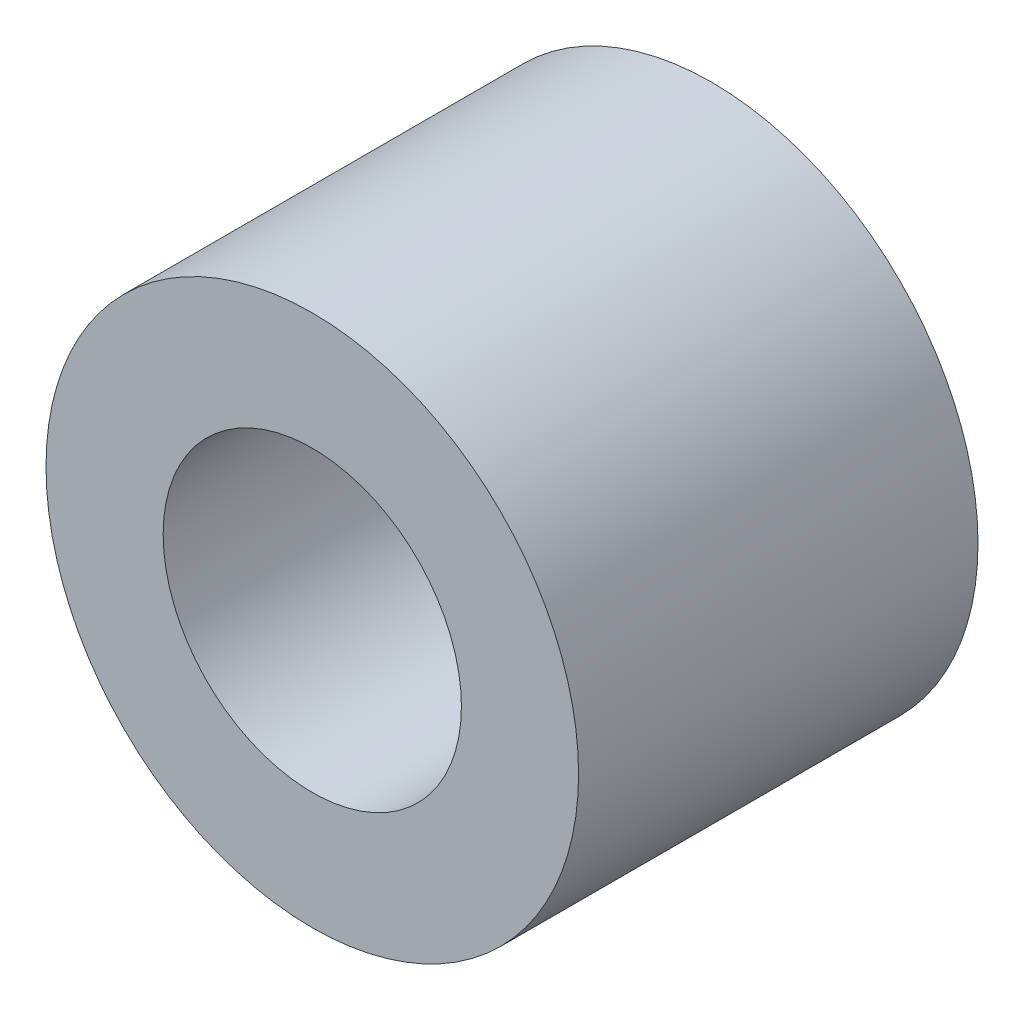
ISO-10303-21;
HEADER;
FILE_DESCRIPTION(('STEP AP214'),'2;1');
FILE_NAME('part.step','',(''),(''),'','','');
FILE_SCHEMA(('AUTOMOTIVE_DESIGN { 1 0 10303 214 1 1 1 1 }'));
ENDSEC;
DATA;
#1=APPLICATION_CONTEXT('core data for automotive mechanical design processes');
#2=APPLICATION_PROTOCOL_DEFINITION('international standard','automotive_design',2000,#1);
#3=PRODUCT_CONTEXT('',#1,'mechanical');
#4=PRODUCT('Part','Part','',(#3));
#5=PRODUCT_RELATED_PRODUCT_CATEGORY('part','',(#4));
#6=PRODUCT_DEFINITION_FORMATION('','',#4);
#7=PRODUCT_DEFINITION_CONTEXT('part definition',#1,'design');
#8=PRODUCT_DEFINITION('design','',#6,#7);
#9=PRODUCT_DEFINITION_SHAPE('','',#8);
#10=(LENGTH_UNIT() NAMED_UNIT(*) SI_UNIT(.MILLI.,.METRE.));
#11=(NAMED_UNIT(*) PLANE_ANGLE_UNIT() SI_UNIT($,.RADIAN.));
#12=(NAMED_UNIT(*) SI_UNIT($,.STERADIAN.) SOLID_ANGLE_UNIT());
#13=UNCERTAINTY_MEASURE_WITH_UNIT(LENGTH_MEASURE(1.E-05),#10,'distance_accuracy_value','');
#14=(GEOMETRIC_REPRESENTATION_CONTEXT(3) GLOBAL_UNCERTAINTY_ASSIGNED_CONTEXT((#13)) GLOBAL_UNIT_ASSIGNED_CONTEXT((#10,
#11,#12)) REPRESENTATION_CONTEXT('',''));
#15=CARTESIAN_POINT('',(0.,0.,0.));
#16=DIRECTION('',(0.,0.,1.));
#17=DIRECTION('',(1.,0.,0.));
#18=AXIS2_PLACEMENT_3D('',#15,#16,#17);
#19=CARTESIAN_POINT('',(0.,0.,2.38125));
#20=DIRECTION('',(0.,0.,1.));
#21=DIRECTION('',(1.,0.,0.));
#22=AXIS2_PLACEMENT_3D('',#19,#20,#21);
#23=PLANE('',#22);
#24=CARTESIAN_POINT('',(0.,0.,2.38125));
#25=DIRECTION('',(0.,0.,1.));
#26=DIRECTION('',(1.,0.,0.));
#27=AXIS2_PLACEMENT_3D('',#24,#25,#26);
#28=CIRCLE('',#27,3.175);
#29=CARTESIAN_POINT('',(-3.175,0.,2.38125));
#30=VERTEX_POINT('',#29);
#31=EDGE_CURVE('E10',#30,#30,#28,.T.);
#32=ORIENTED_EDGE('',*,*,#31,.T.);
#33=EDGE_LOOP('',(#32));
#34=FACE_BOUND('',#33,.T.);
#35=CARTESIAN_POINT('',(0.,0.,2.38125));
#36=DIRECTION('',(0.,0.,1.));
#37=DIRECTION('',(1.,0.,0.));
#38=AXIS2_PLACEMENT_3D('',#35,#36,#37);
#39=CIRCLE('',#38,1.778);
#40=CARTESIAN_POINT('',(-1.778,0.,2.38125));
#41=VERTEX_POINT('',#40);
#42=EDGE_CURVE('E41',#41,#41,#39,.T.);
#43=ORIENTED_EDGE('',*,*,#42,.F.);
#44=EDGE_LOOP('',(#43));
#45=FACE_BOUND('',#44,.T.);
#46=ADVANCED_FACE('F30',(#34,#45),#23,.T.);
#47=CARTESIAN_POINT('',(0.,0.,-2.38125));
#48=DIRECTION('',(0.,0.,1.));
#49=DIRECTION('',(1.,0.,0.));
#50=AXIS2_PLACEMENT_3D('',#47,#48,#49);
#51=PLANE('',#50);
#52=CARTESIAN_POINT('',(0.,0.,-2.38125));
#53=DIRECTION('',(0.,0.,1.));
#54=DIRECTION('',(1.,0.,0.));
#55=AXIS2_PLACEMENT_3D('',#52,#53,#54);
#56=CIRCLE('',#55,3.175);
#57=CARTESIAN_POINT('',(-3.175,0.,-2.38125));
#58=VERTEX_POINT('',#57);
#59=EDGE_CURVE('E34',#58,#58,#56,.T.);
#60=ORIENTED_EDGE('',*,*,#59,.F.);
#61=EDGE_LOOP('',(#60));
#62=FACE_BOUND('',#61,.T.);
#63=CARTESIAN_POINT('',(0.,0.,-2.38125));
#64=DIRECTION('',(0.,0.,1.));
#65=DIRECTION('',(1.,0.,0.));
#66=AXIS2_PLACEMENT_3D('',#63,#64,#65);
#67=CIRCLE('',#66,1.778);
#68=CARTESIAN_POINT('',(-1.778,0.,-2.38125));
#69=VERTEX_POINT('',#68);
#70=EDGE_CURVE('E43',#69,#69,#67,.T.);
#71=ORIENTED_EDGE('',*,*,#70,.T.);
#72=EDGE_LOOP('',(#71));
#73=FACE_BOUND('',#72,.T.);
#74=ADVANCED_FACE('F53',(#62,#73),#51,.F.);
#75=CARTESIAN_POINT('',(0.,0.,2.38125));
#76=DIRECTION('',(0.,0.,-1.));
#77=DIRECTION('',(-1.,0.,0.));
#78=AXIS2_PLACEMENT_3D('',#75,#76,#77);
#79=CYLINDRICAL_SURFACE('',#78,3.175);
#80=CARTESIAN_POINT('',(-3.175,0.,2.38125));
#81=CARTESIAN_POINT('',(-3.175,0.,2.331640625));
#82=CARTESIAN_POINT('',(-3.175,0.,2.28203125));
#83=CARTESIAN_POINT('',(-3.175,0.,2.1828125));
#84=CARTESIAN_POINT('',(-3.175,0.,2.133203125));
#85=CARTESIAN_POINT('',(-3.175,0.,2.033984375));
#86=CARTESIAN_POINT('',(-3.175,0.,1.984375));
#87=CARTESIAN_POINT('',(-3.175,0.,1.88515625));
#88=CARTESIAN_POINT('',(-3.175,0.,1.835546875));
#89=CARTESIAN_POINT('',(-3.175,0.,1.736328125));
#90=CARTESIAN_POINT('',(-3.175,0.,1.68671875));
#91=CARTESIAN_POINT('',(-3.175,0.,1.5875));
#92=CARTESIAN_POINT('',(-3.175,0.,1.537890625));
#93=CARTESIAN_POINT('',(-3.175,0.,1.438671875));
#94=CARTESIAN_POINT('',(-3.175,0.,1.3890625));
#95=CARTESIAN_POINT('',(-3.175,0.,1.28984375));
#96=CARTESIAN_POINT('',(-3.175,0.,1.240234375));
#97=CARTESIAN_POINT('',(-3.175,0.,1.141015625));
#98=CARTESIAN_POINT('',(-3.175,0.,1.09140625));
#99=CARTESIAN_POINT('',(-3.175,0.,0.9921875));
#100=CARTESIAN_POINT('',(-3.175,0.,0.942578125));
#101=CARTESIAN_POINT('',(-3.175,0.,0.843359375));
#102=CARTESIAN_POINT('',(-3.175,0.,0.79375));
#103=CARTESIAN_POINT('',(-3.175,0.,0.69453125));
#104=CARTESIAN_POINT('',(-3.175,0.,0.644921875));
#105=CARTESIAN_POINT('',(-3.175,0.,0.545703125));
#106=CARTESIAN_POINT('',(-3.175,0.,0.49609375));
#107=CARTESIAN_POINT('',(-3.175,0.,0.396875));
#108=CARTESIAN_POINT('',(-3.175,0.,0.347265625));
#109=CARTESIAN_POINT('',(-3.175,0.,0.248046875));
#110=CARTESIAN_POINT('',(-3.175,0.,0.1984375));
#111=CARTESIAN_POINT('',(-3.175,0.,0.0992187499999996));
#112=CARTESIAN_POINT('',(-3.175,0.,0.0496093749999996));
#113=CARTESIAN_POINT('',(-3.175,0.,-0.0496093750000005));
#114=CARTESIAN_POINT('',(-3.175,0.,-0.0992187500000005));
#115=CARTESIAN_POINT('',(-3.175,0.,-0.198437500000001));
#116=CARTESIAN_POINT('',(-3.175,0.,-0.248046875000001));
#117=CARTESIAN_POINT('',(-3.175,0.,-0.347265625000001));
#118=CARTESIAN_POINT('',(-3.175,0.,-0.396875000000001));
#119=CARTESIAN_POINT('',(-3.175,0.,-0.496093750000001));
#120=CARTESIAN_POINT('',(-3.175,0.,-0.545703125000001));
#121=CARTESIAN_POINT('',(-3.175,0.,-0.644921875000001));
#122=CARTESIAN_POINT('',(-3.175,0.,-0.694531250000001));
#123=CARTESIAN_POINT('',(-3.175,0.,-0.793750000000001));
#124=CARTESIAN_POINT('',(-3.175,0.,-0.843359375));
#125=CARTESIAN_POINT('',(-3.175,0.,-0.942578125000001));
#126=CARTESIAN_POINT('',(-3.175,0.,-0.992187500000001));
#127=CARTESIAN_POINT('',(-3.175,0.,-1.09140625));
#128=CARTESIAN_POINT('',(-3.175,0.,-1.141015625));
#129=CARTESIAN_POINT('',(-3.175,0.,-1.240234375));
#130=CARTESIAN_POINT('',(-3.175,0.,-1.28984375));
#131=CARTESIAN_POINT('',(-3.175,0.,-1.3890625));
#132=CARTESIAN_POINT('',(-3.175,0.,-1.438671875));
#133=CARTESIAN_POINT('',(-3.175,0.,-1.537890625));
#134=CARTESIAN_POINT('',(-3.175,0.,-1.5875));
#135=CARTESIAN_POINT('',(-3.175,0.,-1.68671875));
#136=CARTESIAN_POINT('',(-3.175,0.,-1.736328125));
#137=CARTESIAN_POINT('',(-3.175,0.,-1.835546875));
#138=CARTESIAN_POINT('',(-3.175,0.,-1.88515625));
#139=CARTESIAN_POINT('',(-3.175,0.,-1.984375));
#140=CARTESIAN_POINT('',(-3.175,0.,-2.033984375));
#141=CARTESIAN_POINT('',(-3.175,0.,-2.133203125));
#142=CARTESIAN_POINT('',(-3.175,0.,-2.1828125));
#143=CARTESIAN_POINT('',(-3.175,0.,-2.28203125));
#144=CARTESIAN_POINT('',(-3.175,0.,-2.331640625));
#145=CARTESIAN_POINT('',(-3.175,0.,-2.38125));
#146=B_SPLINE_CURVE_WITH_KNOTS('',3,(#80,#81,#82,#83,#84,#85,#86,#87,#88,#89,#90,#91,#92,#93,
#94,#95,#96,#97,#98,#99,#100,#101,#102,#103,#104,#105,#106,#107,#108,#109,#110,#111,#112,#113,
#114,#115,#116,#117,#118,#119,#120,#121,#122,#123,#124,#125,#126,#127,#128,#129,#130,#131,#132,
#133,#134,#135,#136,#137,#138,#139,#140,#141,#142,#143,#144,#145),.UNSPECIFIED.,.F.,.F.,(4,2,2,
2,2,2,2,2,2,2,2,2,2,2,2,2,2,2,2,2,2,2,2,2,2,2,2,2,2,2,2,2,4),(0.,0.148828125,0.29765625,
0.446484375,0.5953125,0.744140625,0.89296875,1.041796875,1.190625,1.339453125,1.48828125,
1.637109375,1.7859375,1.934765625,2.08359375,2.232421875,2.38125,2.530078125,2.67890625,
2.827734375,2.9765625,3.125390625,3.27421875,3.423046875,3.571875,3.720703125,3.86953125,
4.018359375,4.1671875,4.316015625,4.46484375,4.613671875,4.7625),.UNSPECIFIED.);
#147=EDGE_CURVE('BSEAM32',#30,#58,#146,.T.);
#148=ORIENTED_EDGE('',*,*,#31,.F.);
#149=ORIENTED_EDGE('',*,*,#59,.T.);
#150=ORIENTED_EDGE('',*,*,#147,.T.);
#151=ORIENTED_EDGE('',*,*,#147,.F.);
#152=EDGE_LOOP('',(#148,#150,#149,#151));
#153=FACE_BOUND('',#152,.T.);
#154=ADVANCED_FACE('F32',(#153),#79,.T.);
#155=CARTESIAN_POINT('',(0.,0.,2.38125));
#156=DIRECTION('',(0.,0.,-1.));
#157=DIRECTION('',(-1.,0.,0.));
#158=AXIS2_PLACEMENT_3D('',#155,#156,#157);
#159=CYLINDRICAL_SURFACE('',#158,1.778);
#160=CARTESIAN_POINT('',(-1.778,0.,2.38125));
#161=CARTESIAN_POINT('',(-1.778,0.,2.331640625));
#162=CARTESIAN_POINT('',(-1.778,0.,2.28203125));
#163=CARTESIAN_POINT('',(-1.778,0.,2.1828125));
#164=CARTESIAN_POINT('',(-1.778,0.,2.133203125));
#165=CARTESIAN_POINT('',(-1.778,0.,2.033984375));
#166=CARTESIAN_POINT('',(-1.778,0.,1.984375));
#167=CARTESIAN_POINT('',(-1.778,0.,1.88515625));
#168=CARTESIAN_POINT('',(-1.778,0.,1.835546875));
#169=CARTESIAN_POINT('',(-1.778,0.,1.736328125));
#170=CARTESIAN_POINT('',(-1.778,0.,1.68671875));
#171=CARTESIAN_POINT('',(-1.778,0.,1.5875));
#172=CARTESIAN_POINT('',(-1.778,0.,1.537890625));
#173=CARTESIAN_POINT('',(-1.778,0.,1.438671875));
#174=CARTESIAN_POINT('',(-1.778,0.,1.3890625));
#175=CARTESIAN_POINT('',(-1.778,0.,1.28984375));
#176=CARTESIAN_POINT('',(-1.778,0.,1.240234375));
#177=CARTESIAN_POINT('',(-1.778,0.,1.141015625));
#178=CARTESIAN_POINT('',(-1.778,0.,1.09140625));
#179=CARTESIAN_POINT('',(-1.778,0.,0.9921875));
#180=CARTESIAN_POINT('',(-1.778,0.,0.942578125));
#181=CARTESIAN_POINT('',(-1.778,0.,0.843359375));
#182=CARTESIAN_POINT('',(-1.778,0.,0.79375));
#183=CARTESIAN_POINT('',(-1.778,0.,0.69453125));
#184=CARTESIAN_POINT('',(-1.778,0.,0.644921875));
#185=CARTESIAN_POINT('',(-1.778,0.,0.545703125));
#186=CARTESIAN_POINT('',(-1.778,0.,0.49609375));
#187=CARTESIAN_POINT('',(-1.778,0.,0.396875));
#188=CARTESIAN_POINT('',(-1.778,0.,0.347265625));
#189=CARTESIAN_POINT('',(-1.778,0.,0.248046875));
#190=CARTESIAN_POINT('',(-1.778,0.,0.1984375));
#191=CARTESIAN_POINT('',(-1.778,0.,0.09921875));
#192=CARTESIAN_POINT('',(-1.778,0.,0.049609375));
#193=CARTESIAN_POINT('',(-1.778,0.,-0.049609375));
#194=CARTESIAN_POINT('',(-1.778,0.,-0.09921875));
#195=CARTESIAN_POINT('',(-1.778,0.,-0.1984375));
#196=CARTESIAN_POINT('',(-1.778,0.,-0.248046875));
#197=CARTESIAN_POINT('',(-1.778,0.,-0.347265625));
#198=CARTESIAN_POINT('',(-1.778,0.,-0.396875));
#199=CARTESIAN_POINT('',(-1.778,0.,-0.49609375));
#200=CARTESIAN_POINT('',(-1.778,0.,-0.545703125));
#201=CARTESIAN_POINT('',(-1.778,0.,-0.644921875));
#202=CARTESIAN_POINT('',(-1.778,0.,-0.69453125));
#203=CARTESIAN_POINT('',(-1.778,0.,-0.79375));
#204=CARTESIAN_POINT('',(-1.778,0.,-0.843359375));
#205=CARTESIAN_POINT('',(-1.778,0.,-0.942578125));
#206=CARTESIAN_POINT('',(-1.778,0.,-0.9921875));
#207=CARTESIAN_POINT('',(-1.778,0.,-1.09140625));
#208=CARTESIAN_POINT('',(-1.778,0.,-1.141015625));
#209=CARTESIAN_POINT('',(-1.778,0.,-1.240234375));
#210=CARTESIAN_POINT('',(-1.778,0.,-1.28984375));
#211=CARTESIAN_POINT('',(-1.778,0.,-1.3890625));
#212=CARTESIAN_POINT('',(-1.778,0.,-1.438671875));
#213=CARTESIAN_POINT('',(-1.778,0.,-1.537890625));
#214=CARTESIAN_POINT('',(-1.778,0.,-1.5875));
#215=CARTESIAN_POINT('',(-1.778,0.,-1.68671875));
#216=CARTESIAN_POINT('',(-1.778,0.,-1.736328125));
#217=CARTESIAN_POINT('',(-1.778,0.,-1.835546875));
#218=CARTESIAN_POINT('',(-1.778,0.,-1.88515625));
#219=CARTESIAN_POINT('',(-1.778,0.,-1.984375));
#220=CARTESIAN_POINT('',(-1.778,0.,-2.033984375));
#221=CARTESIAN_POINT('',(-1.778,0.,-2.133203125));
#222=CARTESIAN_POINT('',(-1.778,0.,-2.1828125));
#223=CARTESIAN_POINT('',(-1.778,0.,-2.28203125));
#224=CARTESIAN_POINT('',(-1.778,0.,-2.331640625));
#225=CARTESIAN_POINT('',(-1.778,0.,-2.38125));
#226=B_SPLINE_CURVE_WITH_KNOTS('',3,(#160,#161,#162,#163,#164,#165,#166,#167,#168,#169,#170,
#171,#172,#173,#174,#175,#176,#177,#178,#179,#180,#181,#182,#183,#184,#185,#186,#187,#188,#189,
#190,#191,#192,#193,#194,#195,#196,#197,#198,#199,#200,#201,#202,#203,#204,#205,#206,#207,#208,
#209,#210,#211,#212,#213,#214,#215,#216,#217,#218,#219,#220,#221,#222,#223,#224,#225),
.UNSPECIFIED.,.F.,.F.,(4,2,2,2,2,2,2,2,2,2,2,2,2,2,2,2,2,2,2,2,2,2,2,2,2,2,2,2,2,2,2,2,4),(0.,
0.148828125,0.29765625,0.446484375,0.5953125,0.744140625,0.89296875,1.041796875,1.190625,
1.339453125,1.48828125,1.637109375,1.7859375,1.934765625,2.08359375,2.232421875,2.38125,
2.530078125,2.67890625,2.827734375,2.9765625,3.125390625,3.27421875,3.423046875,3.571875,
3.720703125,3.86953125,4.018359375,4.1671875,4.316015625,4.46484375,4.613671875,4.7625),.UNSPECIFIED.);
#227=EDGE_CURVE('BSEAM49',#41,#69,#226,.T.);
#228=ORIENTED_EDGE('',*,*,#42,.T.);
#229=ORIENTED_EDGE('',*,*,#70,.F.);
#230=ORIENTED_EDGE('',*,*,#227,.T.);
#231=ORIENTED_EDGE('',*,*,#227,.F.);
#232=EDGE_LOOP('',(#228,#230,#229,#231));
#233=FACE_BOUND('',#232,.T.);
#234=ADVANCED_FACE('F49',(#233),#159,.F.);
#235=CLOSED_SHELL('',(#46,#74,#154,#234));
#236=MANIFOLD_SOLID_BREP('B2',#235);
#237=ADVANCED_BREP_SHAPE_REPRESENTATION('',(#18,#236),#14);
#238=SHAPE_DEFINITION_REPRESENTATION(#9,#237);
ENDSEC;
END-ISO-10303-21;
